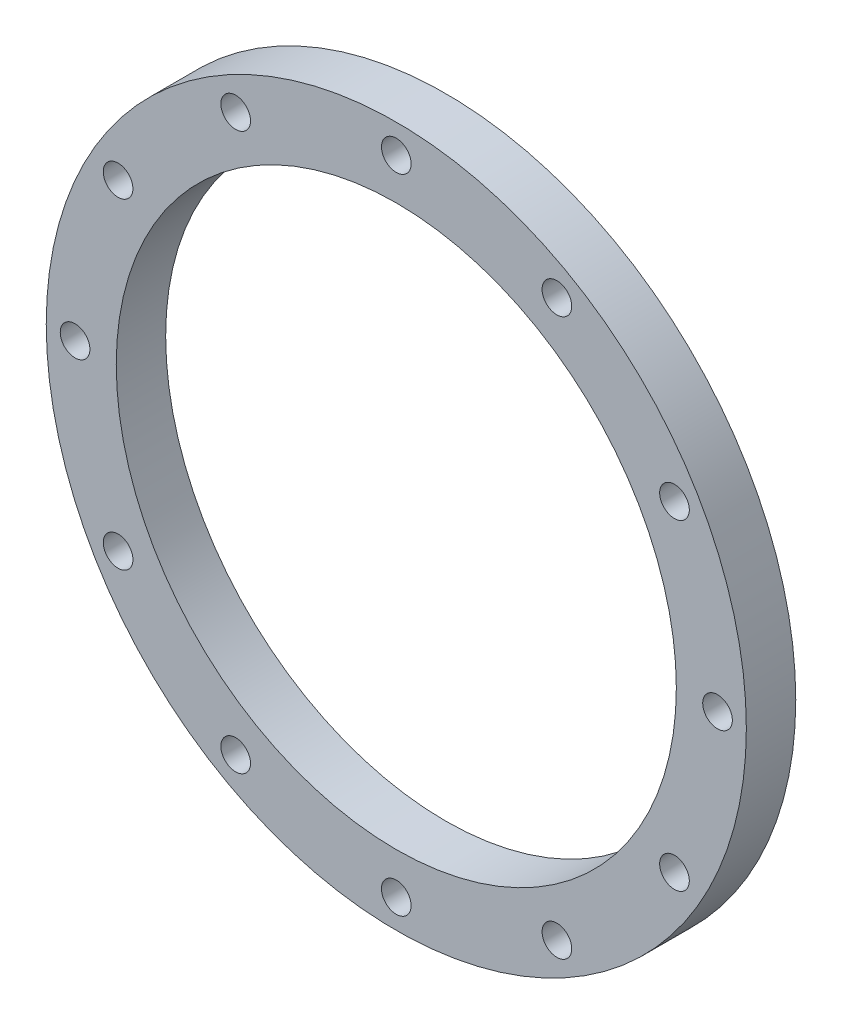
ISO-10303-21;
HEADER;
FILE_DESCRIPTION(('STEP AP214'),'2;1');
FILE_NAME('part.step','',(''),(''),'','','');
FILE_SCHEMA(('AUTOMOTIVE_DESIGN { 1 0 10303 214 1 1 1 1 }'));
ENDSEC;
DATA;
#1=APPLICATION_CONTEXT('core data for automotive mechanical design processes');
#2=APPLICATION_PROTOCOL_DEFINITION('international standard','automotive_design',2000,#1);
#3=PRODUCT_CONTEXT('',#1,'mechanical');
#4=PRODUCT('Part','Part','',(#3));
#5=PRODUCT_RELATED_PRODUCT_CATEGORY('part','',(#4));
#6=PRODUCT_DEFINITION_FORMATION('','',#4);
#7=PRODUCT_DEFINITION_CONTEXT('part definition',#1,'design');
#8=PRODUCT_DEFINITION('design','',#6,#7);
#9=PRODUCT_DEFINITION_SHAPE('','',#8);
#10=(LENGTH_UNIT() NAMED_UNIT(*) SI_UNIT(.MILLI.,.METRE.));
#11=(NAMED_UNIT(*) PLANE_ANGLE_UNIT() SI_UNIT($,.RADIAN.));
#12=(NAMED_UNIT(*) SI_UNIT($,.STERADIAN.) SOLID_ANGLE_UNIT());
#13=UNCERTAINTY_MEASURE_WITH_UNIT(LENGTH_MEASURE(1.E-05),#10,'distance_accuracy_value','');
#14=(GEOMETRIC_REPRESENTATION_CONTEXT(3) GLOBAL_UNCERTAINTY_ASSIGNED_CONTEXT((#13)) GLOBAL_UNIT_ASSIGNED_CONTEXT((#10,
#11,#12)) REPRESENTATION_CONTEXT('',''));
#15=CARTESIAN_POINT('',(0.,0.,0.));
#16=DIRECTION('',(0.,0.,1.));
#17=DIRECTION('',(1.,0.,0.));
#18=AXIS2_PLACEMENT_3D('',#15,#16,#17);
#19=CARTESIAN_POINT('',(0.,0.,6.));
#20=DIRECTION('',(0.,0.,1.));
#21=DIRECTION('',(1.,0.,0.));
#22=AXIS2_PLACEMENT_3D('',#19,#20,#21);
#23=PLANE('',#22);
#24=CARTESIAN_POINT('',(0.,0.,6.));
#25=DIRECTION('',(0.,0.,1.));
#26=DIRECTION('',(1.,0.,0.));
#27=AXIS2_PLACEMENT_3D('',#24,#25,#26);
#28=CIRCLE('',#27,34.);
#29=CARTESIAN_POINT('',(34.,0.,6.));
#30=VERTEX_POINT('',#29);
#31=EDGE_CURVE('E44',#30,#30,#28,.T.);
#32=ORIENTED_EDGE('',*,*,#31,.F.);
#33=EDGE_LOOP('',(#32));
#34=FACE_BOUND('',#33,.T.);
#35=CARTESIAN_POINT('',(0.,0.,6.));
#36=DIRECTION('',(0.,0.,1.));
#37=DIRECTION('',(1.,0.,0.));
#38=AXIS2_PLACEMENT_3D('',#35,#36,#37);
#39=CIRCLE('',#38,42.5);
#40=CARTESIAN_POINT('',(42.5,0.,6.));
#41=VERTEX_POINT('',#40);
#42=EDGE_CURVE('E10',#41,#41,#39,.T.);
#43=ORIENTED_EDGE('',*,*,#42,.T.);
#44=EDGE_LOOP('',(#43));
#45=FACE_BOUND('',#44,.T.);
#46=CARTESIAN_POINT('',(0.,39.,6.));
#47=DIRECTION('',(0.,0.,-1.));
#48=DIRECTION('',(-1.,0.,0.));
#49=AXIS2_PLACEMENT_3D('',#46,#47,#48);
#50=CIRCLE('',#49,1.8);
#51=CARTESIAN_POINT('',(-1.8,39.,6.));
#52=VERTEX_POINT('',#51);
#53=EDGE_CURVE('E49',#52,#52,#50,.T.);
#54=ORIENTED_EDGE('',*,*,#53,.T.);
#55=EDGE_LOOP('',(#54));
#56=FACE_BOUND('',#55,.T.);
#57=CARTESIAN_POINT('',(19.5,33.7749907475931,6.));
#58=DIRECTION('',(0.,0.,-1.));
#59=DIRECTION('',(-1.,0.,0.));
#60=AXIS2_PLACEMENT_3D('',#57,#58,#59);
#61=CIRCLE('',#60,1.8);
#62=CARTESIAN_POINT('',(17.7,33.7749907475931,6.));
#63=VERTEX_POINT('',#62);
#64=EDGE_CURVE('E63',#63,#63,#61,.T.);
#65=ORIENTED_EDGE('',*,*,#64,.T.);
#66=EDGE_LOOP('',(#65));
#67=FACE_BOUND('',#66,.T.);
#68=CARTESIAN_POINT('',(33.7749907475932,19.4999999999999,6.));
#69=DIRECTION('',(0.,0.,-1.));
#70=DIRECTION('',(-1.,0.,0.));
#71=AXIS2_PLACEMENT_3D('',#68,#69,#70);
#72=CIRCLE('',#71,1.8);
#73=CARTESIAN_POINT('',(31.9749907475932,19.4999999999999,6.));
#74=VERTEX_POINT('',#73);
#75=EDGE_CURVE('E75',#74,#74,#72,.T.);
#76=ORIENTED_EDGE('',*,*,#75,.T.);
#77=EDGE_LOOP('',(#76));
#78=FACE_BOUND('',#77,.T.);
#79=CARTESIAN_POINT('',(39.,-1.36167772214882E-13,6.));
#80=DIRECTION('',(0.,0.,-1.));
#81=DIRECTION('',(-1.,0.,0.));
#82=AXIS2_PLACEMENT_3D('',#79,#80,#81);
#83=CIRCLE('',#82,1.8);
#84=CARTESIAN_POINT('',(37.2,-1.36167772214882E-13,6.));
#85=VERTEX_POINT('',#84);
#86=EDGE_CURVE('E87',#85,#85,#83,.T.);
#87=ORIENTED_EDGE('',*,*,#86,.T.);
#88=EDGE_LOOP('',(#87));
#89=FACE_BOUND('',#88,.T.);
#90=CARTESIAN_POINT('',(33.774990747593,-19.5000000000002,6.));
#91=DIRECTION('',(0.,0.,-1.));
#92=DIRECTION('',(-1.,0.,0.));
#93=AXIS2_PLACEMENT_3D('',#90,#91,#92);
#94=CIRCLE('',#93,1.8);
#95=CARTESIAN_POINT('',(31.974990747593,-19.5000000000002,6.));
#96=VERTEX_POINT('',#95);
#97=EDGE_CURVE('E99',#96,#96,#94,.T.);
#98=ORIENTED_EDGE('',*,*,#97,.T.);
#99=EDGE_LOOP('',(#98));
#100=FACE_BOUND('',#99,.T.);
#101=CARTESIAN_POINT('',(19.4999999999998,-33.7749907475932,6.));
#102=DIRECTION('',(0.,0.,-1.));
#103=DIRECTION('',(-1.,0.,0.));
#104=AXIS2_PLACEMENT_3D('',#101,#102,#103);
#105=CIRCLE('',#104,1.8);
#106=CARTESIAN_POINT('',(17.6999999999998,-33.7749907475932,6.));
#107=VERTEX_POINT('',#106);
#108=EDGE_CURVE('E111',#107,#107,#105,.T.);
#109=ORIENTED_EDGE('',*,*,#108,.T.);
#110=EDGE_LOOP('',(#109));
#111=FACE_BOUND('',#110,.T.);
#112=CARTESIAN_POINT('',(0.,-39.,6.));
#113=DIRECTION('',(0.,0.,-1.));
#114=DIRECTION('',(-1.,0.,0.));
#115=AXIS2_PLACEMENT_3D('',#112,#113,#114);
#116=CIRCLE('',#115,1.8);
#117=CARTESIAN_POINT('',(-1.8,-39.,6.));
#118=VERTEX_POINT('',#117);
#119=EDGE_CURVE('E123',#118,#118,#116,.T.);
#120=ORIENTED_EDGE('',*,*,#119,.T.);
#121=EDGE_LOOP('',(#120));
#122=FACE_BOUND('',#121,.T.);
#123=CARTESIAN_POINT('',(-19.5000000000003,-33.774990747593,6.));
#124=DIRECTION('',(0.,0.,-1.));
#125=DIRECTION('',(-1.,0.,0.));
#126=AXIS2_PLACEMENT_3D('',#123,#124,#125);
#127=CIRCLE('',#126,1.8);
#128=CARTESIAN_POINT('',(-21.3000000000003,-33.774990747593,6.));
#129=VERTEX_POINT('',#128);
#130=EDGE_CURVE('E135',#129,#129,#127,.T.);
#131=ORIENTED_EDGE('',*,*,#130,.T.);
#132=EDGE_LOOP('',(#131));
#133=FACE_BOUND('',#132,.T.);
#134=CARTESIAN_POINT('',(-33.7749907475933,-19.4999999999997,6.));
#135=DIRECTION('',(0.,0.,-1.));
#136=DIRECTION('',(-1.,0.,0.));
#137=AXIS2_PLACEMENT_3D('',#134,#135,#136);
#138=CIRCLE('',#137,1.8);
#139=CARTESIAN_POINT('',(-35.5749907475933,-19.4999999999997,6.));
#140=VERTEX_POINT('',#139);
#141=EDGE_CURVE('E147',#140,#140,#138,.T.);
#142=ORIENTED_EDGE('',*,*,#141,.T.);
#143=EDGE_LOOP('',(#142));
#144=FACE_BOUND('',#143,.T.);
#145=CARTESIAN_POINT('',(-39.,4.08503316644647E-13,6.));
#146=DIRECTION('',(0.,0.,-1.));
#147=DIRECTION('',(-1.,0.,0.));
#148=AXIS2_PLACEMENT_3D('',#145,#146,#147);
#149=CIRCLE('',#148,1.8);
#150=CARTESIAN_POINT('',(-40.8,4.08503316644647E-13,6.));
#151=VERTEX_POINT('',#150);
#152=EDGE_CURVE('E159',#151,#151,#149,.T.);
#153=ORIENTED_EDGE('',*,*,#152,.T.);
#154=EDGE_LOOP('',(#153));
#155=FACE_BOUND('',#154,.T.);
#156=CARTESIAN_POINT('',(-33.7749907475929,19.5000000000004,6.));
#157=DIRECTION('',(0.,0.,-1.));
#158=DIRECTION('',(-1.,0.,0.));
#159=AXIS2_PLACEMENT_3D('',#156,#157,#158);
#160=CIRCLE('',#159,1.8);
#161=CARTESIAN_POINT('',(-35.5749907475929,19.5000000000004,6.));
#162=VERTEX_POINT('',#161);
#163=EDGE_CURVE('E171',#162,#162,#160,.T.);
#164=ORIENTED_EDGE('',*,*,#163,.T.);
#165=EDGE_LOOP('',(#164));
#166=FACE_BOUND('',#165,.T.);
#167=CARTESIAN_POINT('',(-19.4999999999996,33.7749907475933,6.));
#168=DIRECTION('',(0.,0.,-1.));
#169=DIRECTION('',(-1.,0.,0.));
#170=AXIS2_PLACEMENT_3D('',#167,#168,#169);
#171=CIRCLE('',#170,1.8);
#172=CARTESIAN_POINT('',(-21.2999999999996,33.7749907475933,6.));
#173=VERTEX_POINT('',#172);
#174=EDGE_CURVE('E183',#173,#173,#171,.T.);
#175=ORIENTED_EDGE('',*,*,#174,.T.);
#176=EDGE_LOOP('',(#175));
#177=FACE_BOUND('',#176,.T.);
#178=ADVANCED_FACE('F33',(#34,#45,#56,#67,#78,#89,#100,#111,#122,#133,#144,#155,#166,#177),#23,.T.);
#179=CARTESIAN_POINT('',(0.,0.,0.));
#180=DIRECTION('',(0.,0.,1.));
#181=DIRECTION('',(1.,0.,0.));
#182=AXIS2_PLACEMENT_3D('',#179,#180,#181);
#183=PLANE('',#182);
#184=CARTESIAN_POINT('',(-19.4999999999996,33.7749907475933,0.));
#185=DIRECTION('',(0.,0.,-1.));
#186=DIRECTION('',(-1.,0.,0.));
#187=AXIS2_PLACEMENT_3D('',#184,#185,#186);
#188=CIRCLE('',#187,3.);
#189=CARTESIAN_POINT('',(-22.4999999999996,33.7749907475933,0.));
#190=VERTEX_POINT('',#189);
#191=EDGE_CURVE('E192',#190,#190,#188,.T.);
#192=ORIENTED_EDGE('',*,*,#191,.F.);
#193=EDGE_LOOP('',(#192));
#194=FACE_BOUND('',#193,.T.);
#195=CARTESIAN_POINT('',(-33.7749907475929,19.5000000000004,0.));
#196=DIRECTION('',(0.,0.,-1.));
#197=DIRECTION('',(-1.,0.,0.));
#198=AXIS2_PLACEMENT_3D('',#195,#196,#197);
#199=CIRCLE('',#198,3.);
#200=CARTESIAN_POINT('',(-36.7749907475929,19.5000000000004,0.));
#201=VERTEX_POINT('',#200);
#202=EDGE_CURVE('E180',#201,#201,#199,.T.);
#203=ORIENTED_EDGE('',*,*,#202,.F.);
#204=EDGE_LOOP('',(#203));
#205=FACE_BOUND('',#204,.T.);
#206=CARTESIAN_POINT('',(-39.,4.08503316644647E-13,0.));
#207=DIRECTION('',(0.,0.,-1.));
#208=DIRECTION('',(-1.,0.,0.));
#209=AXIS2_PLACEMENT_3D('',#206,#207,#208);
#210=CIRCLE('',#209,3.);
#211=CARTESIAN_POINT('',(-42.,4.08503316644647E-13,0.));
#212=VERTEX_POINT('',#211);
#213=EDGE_CURVE('E168',#212,#212,#210,.T.);
#214=ORIENTED_EDGE('',*,*,#213,.F.);
#215=EDGE_LOOP('',(#214));
#216=FACE_BOUND('',#215,.T.);
#217=CARTESIAN_POINT('',(-33.7749907475933,-19.4999999999997,0.));
#218=DIRECTION('',(0.,0.,-1.));
#219=DIRECTION('',(-1.,0.,0.));
#220=AXIS2_PLACEMENT_3D('',#217,#218,#219);
#221=CIRCLE('',#220,3.);
#222=CARTESIAN_POINT('',(-36.7749907475933,-19.4999999999997,0.));
#223=VERTEX_POINT('',#222);
#224=EDGE_CURVE('E156',#223,#223,#221,.T.);
#225=ORIENTED_EDGE('',*,*,#224,.F.);
#226=EDGE_LOOP('',(#225));
#227=FACE_BOUND('',#226,.T.);
#228=CARTESIAN_POINT('',(0.,-39.,0.));
#229=DIRECTION('',(0.,0.,-1.));
#230=DIRECTION('',(-1.,0.,0.));
#231=AXIS2_PLACEMENT_3D('',#228,#229,#230);
#232=CIRCLE('',#231,3.);
#233=CARTESIAN_POINT('',(-3.,-39.,0.));
#234=VERTEX_POINT('',#233);
#235=EDGE_CURVE('E132',#234,#234,#232,.T.);
#236=ORIENTED_EDGE('',*,*,#235,.F.);
#237=EDGE_LOOP('',(#236));
#238=FACE_BOUND('',#237,.T.);
#239=CARTESIAN_POINT('',(19.4999999999998,-33.7749907475932,0.));
#240=DIRECTION('',(0.,0.,-1.));
#241=DIRECTION('',(-1.,0.,0.));
#242=AXIS2_PLACEMENT_3D('',#239,#240,#241);
#243=CIRCLE('',#242,3.);
#244=CARTESIAN_POINT('',(16.4999999999998,-33.7749907475932,0.));
#245=VERTEX_POINT('',#244);
#246=EDGE_CURVE('E120',#245,#245,#243,.T.);
#247=ORIENTED_EDGE('',*,*,#246,.F.);
#248=EDGE_LOOP('',(#247));
#249=FACE_BOUND('',#248,.T.);
#250=CARTESIAN_POINT('',(33.774990747593,-19.5000000000002,0.));
#251=DIRECTION('',(0.,0.,-1.));
#252=DIRECTION('',(-1.,0.,0.));
#253=AXIS2_PLACEMENT_3D('',#250,#251,#252);
#254=CIRCLE('',#253,3.);
#255=CARTESIAN_POINT('',(30.774990747593,-19.5000000000002,0.));
#256=VERTEX_POINT('',#255);
#257=EDGE_CURVE('E108',#256,#256,#254,.T.);
#258=ORIENTED_EDGE('',*,*,#257,.F.);
#259=EDGE_LOOP('',(#258));
#260=FACE_BOUND('',#259,.T.);
#261=CARTESIAN_POINT('',(39.,-1.36167772214882E-13,0.));
#262=DIRECTION('',(0.,0.,-1.));
#263=DIRECTION('',(-1.,0.,0.));
#264=AXIS2_PLACEMENT_3D('',#261,#262,#263);
#265=CIRCLE('',#264,3.);
#266=CARTESIAN_POINT('',(36.,-1.36167772214882E-13,0.));
#267=VERTEX_POINT('',#266);
#268=EDGE_CURVE('E96',#267,#267,#265,.T.);
#269=ORIENTED_EDGE('',*,*,#268,.F.);
#270=EDGE_LOOP('',(#269));
#271=FACE_BOUND('',#270,.T.);
#272=CARTESIAN_POINT('',(33.7749907475932,19.4999999999999,0.));
#273=DIRECTION('',(0.,0.,-1.));
#274=DIRECTION('',(-1.,0.,0.));
#275=AXIS2_PLACEMENT_3D('',#272,#273,#274);
#276=CIRCLE('',#275,3.);
#277=CARTESIAN_POINT('',(30.7749907475932,19.4999999999999,0.));
#278=VERTEX_POINT('',#277);
#279=EDGE_CURVE('E84',#278,#278,#276,.T.);
#280=ORIENTED_EDGE('',*,*,#279,.F.);
#281=EDGE_LOOP('',(#280));
#282=FACE_BOUND('',#281,.T.);
#283=CARTESIAN_POINT('',(19.5,33.7749907475931,0.));
#284=DIRECTION('',(0.,0.,-1.));
#285=DIRECTION('',(-1.,0.,0.));
#286=AXIS2_PLACEMENT_3D('',#283,#284,#285);
#287=CIRCLE('',#286,3.);
#288=CARTESIAN_POINT('',(16.5,33.7749907475931,0.));
#289=VERTEX_POINT('',#288);
#290=EDGE_CURVE('E72',#289,#289,#287,.T.);
#291=ORIENTED_EDGE('',*,*,#290,.F.);
#292=EDGE_LOOP('',(#291));
#293=FACE_BOUND('',#292,.T.);
#294=CARTESIAN_POINT('',(0.,39.,0.));
#295=DIRECTION('',(0.,0.,-1.));
#296=DIRECTION('',(-1.,0.,0.));
#297=AXIS2_PLACEMENT_3D('',#294,#295,#296);
#298=CIRCLE('',#297,3.);
#299=CARTESIAN_POINT('',(-3.,39.,0.));
#300=VERTEX_POINT('',#299);
#301=EDGE_CURVE('E60',#300,#300,#298,.T.);
#302=ORIENTED_EDGE('',*,*,#301,.F.);
#303=EDGE_LOOP('',(#302));
#304=FACE_BOUND('',#303,.T.);
#305=CARTESIAN_POINT('',(0.,0.,0.));
#306=DIRECTION('',(0.,0.,1.));
#307=DIRECTION('',(1.,0.,0.));
#308=AXIS2_PLACEMENT_3D('',#305,#306,#307);
#309=CIRCLE('',#308,42.5);
#310=CARTESIAN_POINT('',(42.5,0.,0.));
#311=VERTEX_POINT('',#310);
#312=EDGE_CURVE('E37',#311,#311,#309,.T.);
#313=ORIENTED_EDGE('',*,*,#312,.F.);
#314=EDGE_LOOP('',(#313));
#315=FACE_BOUND('',#314,.T.);
#316=CARTESIAN_POINT('',(0.,0.,0.));
#317=DIRECTION('',(0.,0.,1.));
#318=DIRECTION('',(1.,0.,0.));
#319=AXIS2_PLACEMENT_3D('',#316,#317,#318);
#320=CIRCLE('',#319,34.);
#321=CARTESIAN_POINT('',(34.,0.,0.));
#322=VERTEX_POINT('',#321);
#323=EDGE_CURVE('E46',#322,#322,#320,.T.);
#324=ORIENTED_EDGE('',*,*,#323,.T.);
#325=EDGE_LOOP('',(#324));
#326=FACE_BOUND('',#325,.T.);
#327=CARTESIAN_POINT('',(-19.5000000000003,-33.774990747593,0.));
#328=DIRECTION('',(0.,0.,-1.));
#329=DIRECTION('',(-1.,0.,0.));
#330=AXIS2_PLACEMENT_3D('',#327,#328,#329);
#331=CIRCLE('',#330,3.);
#332=CARTESIAN_POINT('',(-22.5000000000003,-33.774990747593,0.));
#333=VERTEX_POINT('',#332);
#334=EDGE_CURVE('E144',#333,#333,#331,.T.);
#335=ORIENTED_EDGE('',*,*,#334,.F.);
#336=EDGE_LOOP('',(#335));
#337=FACE_BOUND('',#336,.T.);
#338=ADVANCED_FACE('F198',(#194,#205,#216,#227,#238,#249,#260,#271,#282,#293,#304,#315,#326,
#337),#183,.F.);
#339=CARTESIAN_POINT('',(0.,0.,6.));
#340=DIRECTION('',(0.,0.,-1.));
#341=DIRECTION('',(-1.,0.,0.));
#342=AXIS2_PLACEMENT_3D('',#339,#340,#341);
#343=CYLINDRICAL_SURFACE('',#342,42.5);
#344=ORIENTED_EDGE('',*,*,#42,.F.);
#345=EDGE_LOOP('',(#344));
#346=FACE_BOUND('',#345,.T.);
#347=ORIENTED_EDGE('',*,*,#312,.T.);
#348=EDGE_LOOP('',(#347));
#349=FACE_BOUND('',#348,.T.);
#350=ADVANCED_FACE('F35',(#346,#349),#343,.T.);
#351=CARTESIAN_POINT('',(0.,0.,6.));
#352=DIRECTION('',(0.,0.,-1.));
#353=DIRECTION('',(-1.,0.,0.));
#354=AXIS2_PLACEMENT_3D('',#351,#352,#353);
#355=CYLINDRICAL_SURFACE('',#354,34.);
#356=ORIENTED_EDGE('',*,*,#31,.T.);
#357=EDGE_LOOP('',(#356));
#358=FACE_BOUND('',#357,.T.);
#359=ORIENTED_EDGE('',*,*,#323,.F.);
#360=EDGE_LOOP('',(#359));
#361=FACE_BOUND('',#360,.T.);
#362=ADVANCED_FACE('F251',(#358,#361),#355,.F.);
#363=CARTESIAN_POINT('',(0.,39.,0.));
#364=DIRECTION('',(0.,0.,-1.));
#365=DIRECTION('',(-1.,0.,0.));
#366=AXIS2_PLACEMENT_3D('',#363,#364,#365);
#367=CYLINDRICAL_SURFACE('',#366,1.8);
#368=ORIENTED_EDGE('',*,*,#53,.F.);
#369=EDGE_LOOP('',(#368));
#370=FACE_BOUND('',#369,.T.);
#371=CARTESIAN_POINT('',(0.,39.,3.4));
#372=DIRECTION('',(0.,0.,-1.));
#373=DIRECTION('',(-1.,0.,0.));
#374=AXIS2_PLACEMENT_3D('',#371,#372,#373);
#375=CIRCLE('',#374,1.8);
#376=CARTESIAN_POINT('',(-1.8,39.,3.4));
#377=VERTEX_POINT('',#376);
#378=EDGE_CURVE('E54',#377,#377,#375,.T.);
#379=ORIENTED_EDGE('',*,*,#378,.T.);
#380=EDGE_LOOP('',(#379));
#381=FACE_BOUND('',#380,.T.);
#382=ADVANCED_FACE('F254',(#370,#381),#367,.F.);
#383=CARTESIAN_POINT('',(1.8,39.,3.4));
#384=DIRECTION('',(0.,0.,1.));
#385=DIRECTION('',(1.,0.,0.));
#386=AXIS2_PLACEMENT_3D('',#383,#384,#385);
#387=PLANE('',#386);
#388=ORIENTED_EDGE('',*,*,#378,.F.);
#389=EDGE_LOOP('',(#388));
#390=FACE_BOUND('',#389,.T.);
#391=CARTESIAN_POINT('',(0.,39.,3.4));
#392=DIRECTION('',(0.,0.,-1.));
#393=DIRECTION('',(-1.,0.,0.));
#394=AXIS2_PLACEMENT_3D('',#391,#392,#393);
#395=CIRCLE('',#394,3.);
#396=CARTESIAN_POINT('',(-3.,39.,3.4));
#397=VERTEX_POINT('',#396);
#398=EDGE_CURVE('E57',#397,#397,#395,.T.);
#399=ORIENTED_EDGE('',*,*,#398,.T.);
#400=EDGE_LOOP('',(#399));
#401=FACE_BOUND('',#400,.T.);
#402=ADVANCED_FACE('F258',(#390,#401),#387,.F.);
#403=CARTESIAN_POINT('',(0.,39.,0.));
#404=DIRECTION('',(0.,0.,-1.));
#405=DIRECTION('',(-1.,0.,0.));
#406=AXIS2_PLACEMENT_3D('',#403,#404,#405);
#407=CYLINDRICAL_SURFACE('',#406,3.);
#408=ORIENTED_EDGE('',*,*,#398,.F.);
#409=EDGE_LOOP('',(#408));
#410=FACE_BOUND('',#409,.T.);
#411=ORIENTED_EDGE('',*,*,#301,.T.);
#412=EDGE_LOOP('',(#411));
#413=FACE_BOUND('',#412,.T.);
#414=ADVANCED_FACE('F262',(#410,#413),#407,.F.);
#415=CARTESIAN_POINT('',(19.5,33.7749907475931,0.));
#416=DIRECTION('',(0.,0.,-1.));
#417=DIRECTION('',(-1.,0.,0.));
#418=AXIS2_PLACEMENT_3D('',#415,#416,#417);
#419=CYLINDRICAL_SURFACE('',#418,1.8);
#420=ORIENTED_EDGE('',*,*,#64,.F.);
#421=EDGE_LOOP('',(#420));
#422=FACE_BOUND('',#421,.T.);
#423=CARTESIAN_POINT('',(19.5,33.7749907475931,3.4));
#424=DIRECTION('',(0.,0.,-1.));
#425=DIRECTION('',(-1.,0.,0.));
#426=AXIS2_PLACEMENT_3D('',#423,#424,#425);
#427=CIRCLE('',#426,1.8);
#428=CARTESIAN_POINT('',(17.7,33.7749907475931,3.4));
#429=VERTEX_POINT('',#428);
#430=EDGE_CURVE('E66',#429,#429,#427,.T.);
#431=ORIENTED_EDGE('',*,*,#430,.T.);
#432=EDGE_LOOP('',(#431));
#433=FACE_BOUND('',#432,.T.);
#434=ADVANCED_FACE('F266',(#422,#433),#419,.F.);
#435=CARTESIAN_POINT('',(21.3,33.7749907475931,3.4));
#436=DIRECTION('',(0.,0.,1.));
#437=DIRECTION('',(1.,0.,0.));
#438=AXIS2_PLACEMENT_3D('',#435,#436,#437);
#439=PLANE('',#438);
#440=ORIENTED_EDGE('',*,*,#430,.F.);
#441=EDGE_LOOP('',(#440));
#442=FACE_BOUND('',#441,.T.);
#443=CARTESIAN_POINT('',(19.5,33.7749907475931,3.4));
#444=DIRECTION('',(0.,0.,-1.));
#445=DIRECTION('',(-1.,0.,0.));
#446=AXIS2_PLACEMENT_3D('',#443,#444,#445);
#447=CIRCLE('',#446,3.);
#448=CARTESIAN_POINT('',(16.5,33.7749907475931,3.4));
#449=VERTEX_POINT('',#448);
#450=EDGE_CURVE('E69',#449,#449,#447,.T.);
#451=ORIENTED_EDGE('',*,*,#450,.T.);
#452=EDGE_LOOP('',(#451));
#453=FACE_BOUND('',#452,.T.);
#454=ADVANCED_FACE('F270',(#442,#453),#439,.F.);
#455=CARTESIAN_POINT('',(19.5,33.7749907475931,0.));
#456=DIRECTION('',(0.,0.,-1.));
#457=DIRECTION('',(-1.,0.,0.));
#458=AXIS2_PLACEMENT_3D('',#455,#456,#457);
#459=CYLINDRICAL_SURFACE('',#458,3.);
#460=ORIENTED_EDGE('',*,*,#450,.F.);
#461=EDGE_LOOP('',(#460));
#462=FACE_BOUND('',#461,.T.);
#463=ORIENTED_EDGE('',*,*,#290,.T.);
#464=EDGE_LOOP('',(#463));
#465=FACE_BOUND('',#464,.T.);
#466=ADVANCED_FACE('F274',(#462,#465),#459,.F.);
#467=CARTESIAN_POINT('',(33.7749907475932,19.4999999999999,0.));
#468=DIRECTION('',(0.,0.,-1.));
#469=DIRECTION('',(-1.,0.,0.));
#470=AXIS2_PLACEMENT_3D('',#467,#468,#469);
#471=CYLINDRICAL_SURFACE('',#470,1.8);
#472=ORIENTED_EDGE('',*,*,#75,.F.);
#473=EDGE_LOOP('',(#472));
#474=FACE_BOUND('',#473,.T.);
#475=CARTESIAN_POINT('',(33.7749907475932,19.4999999999999,3.4));
#476=DIRECTION('',(0.,0.,-1.));
#477=DIRECTION('',(-1.,0.,0.));
#478=AXIS2_PLACEMENT_3D('',#475,#476,#477);
#479=CIRCLE('',#478,1.8);
#480=CARTESIAN_POINT('',(31.9749907475932,19.4999999999999,3.4));
#481=VERTEX_POINT('',#480);
#482=EDGE_CURVE('E78',#481,#481,#479,.T.);
#483=ORIENTED_EDGE('',*,*,#482,.T.);
#484=EDGE_LOOP('',(#483));
#485=FACE_BOUND('',#484,.T.);
#486=ADVANCED_FACE('F278',(#474,#485),#471,.F.);
#487=CARTESIAN_POINT('',(35.5749907475932,19.4999999999999,3.4));
#488=DIRECTION('',(0.,0.,1.));
#489=DIRECTION('',(1.,0.,0.));
#490=AXIS2_PLACEMENT_3D('',#487,#488,#489);
#491=PLANE('',#490);
#492=ORIENTED_EDGE('',*,*,#482,.F.);
#493=EDGE_LOOP('',(#492));
#494=FACE_BOUND('',#493,.T.);
#495=CARTESIAN_POINT('',(33.7749907475932,19.4999999999999,3.4));
#496=DIRECTION('',(0.,0.,-1.));
#497=DIRECTION('',(-1.,0.,0.));
#498=AXIS2_PLACEMENT_3D('',#495,#496,#497);
#499=CIRCLE('',#498,3.);
#500=CARTESIAN_POINT('',(30.7749907475932,19.4999999999999,3.4));
#501=VERTEX_POINT('',#500);
#502=EDGE_CURVE('E81',#501,#501,#499,.T.);
#503=ORIENTED_EDGE('',*,*,#502,.T.);
#504=EDGE_LOOP('',(#503));
#505=FACE_BOUND('',#504,.T.);
#506=ADVANCED_FACE('F282',(#494,#505),#491,.F.);
#507=CARTESIAN_POINT('',(33.7749907475932,19.4999999999999,0.));
#508=DIRECTION('',(0.,0.,-1.));
#509=DIRECTION('',(-1.,0.,0.));
#510=AXIS2_PLACEMENT_3D('',#507,#508,#509);
#511=CYLINDRICAL_SURFACE('',#510,3.);
#512=ORIENTED_EDGE('',*,*,#502,.F.);
#513=EDGE_LOOP('',(#512));
#514=FACE_BOUND('',#513,.T.);
#515=ORIENTED_EDGE('',*,*,#279,.T.);
#516=EDGE_LOOP('',(#515));
#517=FACE_BOUND('',#516,.T.);
#518=ADVANCED_FACE('F286',(#514,#517),#511,.F.);
#519=CARTESIAN_POINT('',(39.,-1.36167772214882E-13,0.));
#520=DIRECTION('',(0.,0.,-1.));
#521=DIRECTION('',(-1.,0.,0.));
#522=AXIS2_PLACEMENT_3D('',#519,#520,#521);
#523=CYLINDRICAL_SURFACE('',#522,1.8);
#524=ORIENTED_EDGE('',*,*,#86,.F.);
#525=EDGE_LOOP('',(#524));
#526=FACE_BOUND('',#525,.T.);
#527=CARTESIAN_POINT('',(39.,-1.36167772214882E-13,3.4));
#528=DIRECTION('',(0.,0.,-1.));
#529=DIRECTION('',(-1.,0.,0.));
#530=AXIS2_PLACEMENT_3D('',#527,#528,#529);
#531=CIRCLE('',#530,1.8);
#532=CARTESIAN_POINT('',(37.2,-1.36167772214882E-13,3.4));
#533=VERTEX_POINT('',#532);
#534=EDGE_CURVE('E90',#533,#533,#531,.T.);
#535=ORIENTED_EDGE('',*,*,#534,.T.);
#536=EDGE_LOOP('',(#535));
#537=FACE_BOUND('',#536,.T.);
#538=ADVANCED_FACE('F290',(#526,#537),#523,.F.);
#539=CARTESIAN_POINT('',(40.8,-1.36167772214882E-13,3.4));
#540=DIRECTION('',(0.,0.,1.));
#541=DIRECTION('',(1.,0.,0.));
#542=AXIS2_PLACEMENT_3D('',#539,#540,#541);
#543=PLANE('',#542);
#544=ORIENTED_EDGE('',*,*,#534,.F.);
#545=EDGE_LOOP('',(#544));
#546=FACE_BOUND('',#545,.T.);
#547=CARTESIAN_POINT('',(39.,-1.36167772214882E-13,3.4));
#548=DIRECTION('',(0.,0.,-1.));
#549=DIRECTION('',(-1.,0.,0.));
#550=AXIS2_PLACEMENT_3D('',#547,#548,#549);
#551=CIRCLE('',#550,3.);
#552=CARTESIAN_POINT('',(36.,-1.36167772214882E-13,3.4));
#553=VERTEX_POINT('',#552);
#554=EDGE_CURVE('E93',#553,#553,#551,.T.);
#555=ORIENTED_EDGE('',*,*,#554,.T.);
#556=EDGE_LOOP('',(#555));
#557=FACE_BOUND('',#556,.T.);
#558=ADVANCED_FACE('F294',(#546,#557),#543,.F.);
#559=CARTESIAN_POINT('',(39.,-1.36167772214882E-13,0.));
#560=DIRECTION('',(0.,0.,-1.));
#561=DIRECTION('',(-1.,0.,0.));
#562=AXIS2_PLACEMENT_3D('',#559,#560,#561);
#563=CYLINDRICAL_SURFACE('',#562,3.);
#564=ORIENTED_EDGE('',*,*,#554,.F.);
#565=EDGE_LOOP('',(#564));
#566=FACE_BOUND('',#565,.T.);
#567=ORIENTED_EDGE('',*,*,#268,.T.);
#568=EDGE_LOOP('',(#567));
#569=FACE_BOUND('',#568,.T.);
#570=ADVANCED_FACE('F298',(#566,#569),#563,.F.);
#571=CARTESIAN_POINT('',(33.774990747593,-19.5000000000002,0.));
#572=DIRECTION('',(0.,0.,-1.));
#573=DIRECTION('',(-1.,0.,0.));
#574=AXIS2_PLACEMENT_3D('',#571,#572,#573);
#575=CYLINDRICAL_SURFACE('',#574,1.8);
#576=ORIENTED_EDGE('',*,*,#97,.F.);
#577=EDGE_LOOP('',(#576));
#578=FACE_BOUND('',#577,.T.);
#579=CARTESIAN_POINT('',(33.774990747593,-19.5000000000002,3.4));
#580=DIRECTION('',(0.,0.,-1.));
#581=DIRECTION('',(-1.,0.,0.));
#582=AXIS2_PLACEMENT_3D('',#579,#580,#581);
#583=CIRCLE('',#582,1.8);
#584=CARTESIAN_POINT('',(31.974990747593,-19.5000000000002,3.4));
#585=VERTEX_POINT('',#584);
#586=EDGE_CURVE('E102',#585,#585,#583,.T.);
#587=ORIENTED_EDGE('',*,*,#586,.T.);
#588=EDGE_LOOP('',(#587));
#589=FACE_BOUND('',#588,.T.);
#590=ADVANCED_FACE('F302',(#578,#589),#575,.F.);
#591=CARTESIAN_POINT('',(35.574990747593,-19.5000000000002,3.4));
#592=DIRECTION('',(0.,0.,1.));
#593=DIRECTION('',(1.,0.,0.));
#594=AXIS2_PLACEMENT_3D('',#591,#592,#593);
#595=PLANE('',#594);
#596=ORIENTED_EDGE('',*,*,#586,.F.);
#597=EDGE_LOOP('',(#596));
#598=FACE_BOUND('',#597,.T.);
#599=CARTESIAN_POINT('',(33.774990747593,-19.5000000000002,3.4));
#600=DIRECTION('',(0.,0.,-1.));
#601=DIRECTION('',(-1.,0.,0.));
#602=AXIS2_PLACEMENT_3D('',#599,#600,#601);
#603=CIRCLE('',#602,3.);
#604=CARTESIAN_POINT('',(30.774990747593,-19.5000000000002,3.4));
#605=VERTEX_POINT('',#604);
#606=EDGE_CURVE('E105',#605,#605,#603,.T.);
#607=ORIENTED_EDGE('',*,*,#606,.T.);
#608=EDGE_LOOP('',(#607));
#609=FACE_BOUND('',#608,.T.);
#610=ADVANCED_FACE('F306',(#598,#609),#595,.F.);
#611=CARTESIAN_POINT('',(33.774990747593,-19.5000000000002,0.));
#612=DIRECTION('',(0.,0.,-1.));
#613=DIRECTION('',(-1.,0.,0.));
#614=AXIS2_PLACEMENT_3D('',#611,#612,#613);
#615=CYLINDRICAL_SURFACE('',#614,3.);
#616=ORIENTED_EDGE('',*,*,#606,.F.);
#617=EDGE_LOOP('',(#616));
#618=FACE_BOUND('',#617,.T.);
#619=ORIENTED_EDGE('',*,*,#257,.T.);
#620=EDGE_LOOP('',(#619));
#621=FACE_BOUND('',#620,.T.);
#622=ADVANCED_FACE('F310',(#618,#621),#615,.F.);
#623=CARTESIAN_POINT('',(19.4999999999998,-33.7749907475932,0.));
#624=DIRECTION('',(0.,0.,-1.));
#625=DIRECTION('',(-1.,0.,0.));
#626=AXIS2_PLACEMENT_3D('',#623,#624,#625);
#627=CYLINDRICAL_SURFACE('',#626,1.8);
#628=ORIENTED_EDGE('',*,*,#108,.F.);
#629=EDGE_LOOP('',(#628));
#630=FACE_BOUND('',#629,.T.);
#631=CARTESIAN_POINT('',(19.4999999999998,-33.7749907475932,3.4));
#632=DIRECTION('',(0.,0.,-1.));
#633=DIRECTION('',(-1.,0.,0.));
#634=AXIS2_PLACEMENT_3D('',#631,#632,#633);
#635=CIRCLE('',#634,1.8);
#636=CARTESIAN_POINT('',(17.6999999999998,-33.7749907475932,3.4));
#637=VERTEX_POINT('',#636);
#638=EDGE_CURVE('E114',#637,#637,#635,.T.);
#639=ORIENTED_EDGE('',*,*,#638,.T.);
#640=EDGE_LOOP('',(#639));
#641=FACE_BOUND('',#640,.T.);
#642=ADVANCED_FACE('F314',(#630,#641),#627,.F.);
#643=CARTESIAN_POINT('',(21.2999999999998,-33.7749907475932,3.4));
#644=DIRECTION('',(0.,0.,1.));
#645=DIRECTION('',(1.,0.,0.));
#646=AXIS2_PLACEMENT_3D('',#643,#644,#645);
#647=PLANE('',#646);
#648=ORIENTED_EDGE('',*,*,#638,.F.);
#649=EDGE_LOOP('',(#648));
#650=FACE_BOUND('',#649,.T.);
#651=CARTESIAN_POINT('',(19.4999999999998,-33.7749907475932,3.4));
#652=DIRECTION('',(0.,0.,-1.));
#653=DIRECTION('',(-1.,0.,0.));
#654=AXIS2_PLACEMENT_3D('',#651,#652,#653);
#655=CIRCLE('',#654,3.);
#656=CARTESIAN_POINT('',(16.4999999999998,-33.7749907475932,3.4));
#657=VERTEX_POINT('',#656);
#658=EDGE_CURVE('E117',#657,#657,#655,.T.);
#659=ORIENTED_EDGE('',*,*,#658,.T.);
#660=EDGE_LOOP('',(#659));
#661=FACE_BOUND('',#660,.T.);
#662=ADVANCED_FACE('F318',(#650,#661),#647,.F.);
#663=CARTESIAN_POINT('',(19.4999999999998,-33.7749907475932,0.));
#664=DIRECTION('',(0.,0.,-1.));
#665=DIRECTION('',(-1.,0.,0.));
#666=AXIS2_PLACEMENT_3D('',#663,#664,#665);
#667=CYLINDRICAL_SURFACE('',#666,3.);
#668=ORIENTED_EDGE('',*,*,#658,.F.);
#669=EDGE_LOOP('',(#668));
#670=FACE_BOUND('',#669,.T.);
#671=ORIENTED_EDGE('',*,*,#246,.T.);
#672=EDGE_LOOP('',(#671));
#673=FACE_BOUND('',#672,.T.);
#674=ADVANCED_FACE('F322',(#670,#673),#667,.F.);
#675=CARTESIAN_POINT('',(0.,-39.,0.));
#676=DIRECTION('',(0.,0.,-1.));
#677=DIRECTION('',(-1.,0.,0.));
#678=AXIS2_PLACEMENT_3D('',#675,#676,#677);
#679=CYLINDRICAL_SURFACE('',#678,1.8);
#680=ORIENTED_EDGE('',*,*,#119,.F.);
#681=EDGE_LOOP('',(#680));
#682=FACE_BOUND('',#681,.T.);
#683=CARTESIAN_POINT('',(0.,-39.,3.4));
#684=DIRECTION('',(0.,0.,-1.));
#685=DIRECTION('',(-1.,0.,0.));
#686=AXIS2_PLACEMENT_3D('',#683,#684,#685);
#687=CIRCLE('',#686,1.8);
#688=CARTESIAN_POINT('',(-1.8,-39.,3.4));
#689=VERTEX_POINT('',#688);
#690=EDGE_CURVE('E126',#689,#689,#687,.T.);
#691=ORIENTED_EDGE('',*,*,#690,.T.);
#692=EDGE_LOOP('',(#691));
#693=FACE_BOUND('',#692,.T.);
#694=ADVANCED_FACE('F326',(#682,#693),#679,.F.);
#695=CARTESIAN_POINT('',(1.8,-39.,3.4));
#696=DIRECTION('',(0.,0.,1.));
#697=DIRECTION('',(1.,0.,0.));
#698=AXIS2_PLACEMENT_3D('',#695,#696,#697);
#699=PLANE('',#698);
#700=ORIENTED_EDGE('',*,*,#690,.F.);
#701=EDGE_LOOP('',(#700));
#702=FACE_BOUND('',#701,.T.);
#703=CARTESIAN_POINT('',(0.,-39.,3.4));
#704=DIRECTION('',(0.,0.,-1.));
#705=DIRECTION('',(-1.,0.,0.));
#706=AXIS2_PLACEMENT_3D('',#703,#704,#705);
#707=CIRCLE('',#706,3.);
#708=CARTESIAN_POINT('',(-3.,-39.,3.4));
#709=VERTEX_POINT('',#708);
#710=EDGE_CURVE('E129',#709,#709,#707,.T.);
#711=ORIENTED_EDGE('',*,*,#710,.T.);
#712=EDGE_LOOP('',(#711));
#713=FACE_BOUND('',#712,.T.);
#714=ADVANCED_FACE('F330',(#702,#713),#699,.F.);
#715=CARTESIAN_POINT('',(0.,-39.,0.));
#716=DIRECTION('',(0.,0.,-1.));
#717=DIRECTION('',(-1.,0.,0.));
#718=AXIS2_PLACEMENT_3D('',#715,#716,#717);
#719=CYLINDRICAL_SURFACE('',#718,3.);
#720=ORIENTED_EDGE('',*,*,#710,.F.);
#721=EDGE_LOOP('',(#720));
#722=FACE_BOUND('',#721,.T.);
#723=ORIENTED_EDGE('',*,*,#235,.T.);
#724=EDGE_LOOP('',(#723));
#725=FACE_BOUND('',#724,.T.);
#726=ADVANCED_FACE('F334',(#722,#725),#719,.F.);
#727=CARTESIAN_POINT('',(-19.5000000000003,-33.774990747593,0.));
#728=DIRECTION('',(0.,0.,-1.));
#729=DIRECTION('',(-1.,0.,0.));
#730=AXIS2_PLACEMENT_3D('',#727,#728,#729);
#731=CYLINDRICAL_SURFACE('',#730,1.8);
#732=ORIENTED_EDGE('',*,*,#130,.F.);
#733=EDGE_LOOP('',(#732));
#734=FACE_BOUND('',#733,.T.);
#735=CARTESIAN_POINT('',(-19.5000000000003,-33.774990747593,3.4));
#736=DIRECTION('',(0.,0.,-1.));
#737=DIRECTION('',(-1.,0.,0.));
#738=AXIS2_PLACEMENT_3D('',#735,#736,#737);
#739=CIRCLE('',#738,1.8);
#740=CARTESIAN_POINT('',(-21.3000000000003,-33.774990747593,3.4));
#741=VERTEX_POINT('',#740);
#742=EDGE_CURVE('E138',#741,#741,#739,.T.);
#743=ORIENTED_EDGE('',*,*,#742,.T.);
#744=EDGE_LOOP('',(#743));
#745=FACE_BOUND('',#744,.T.);
#746=ADVANCED_FACE('F240',(#734,#745),#731,.F.);
#747=CARTESIAN_POINT('',(-17.7000000000003,-33.774990747593,3.4));
#748=DIRECTION('',(0.,0.,1.));
#749=DIRECTION('',(1.,0.,0.));
#750=AXIS2_PLACEMENT_3D('',#747,#748,#749);
#751=PLANE('',#750);
#752=ORIENTED_EDGE('',*,*,#742,.F.);
#753=EDGE_LOOP('',(#752));
#754=FACE_BOUND('',#753,.T.);
#755=CARTESIAN_POINT('',(-19.5000000000003,-33.774990747593,3.4));
#756=DIRECTION('',(0.,0.,-1.));
#757=DIRECTION('',(-1.,0.,0.));
#758=AXIS2_PLACEMENT_3D('',#755,#756,#757);
#759=CIRCLE('',#758,3.);
#760=CARTESIAN_POINT('',(-22.5000000000003,-33.774990747593,3.4));
#761=VERTEX_POINT('',#760);
#762=EDGE_CURVE('E141',#761,#761,#759,.T.);
#763=ORIENTED_EDGE('',*,*,#762,.T.);
#764=EDGE_LOOP('',(#763));
#765=FACE_BOUND('',#764,.T.);
#766=ADVANCED_FACE('F230',(#754,#765),#751,.F.);
#767=CARTESIAN_POINT('',(-19.5000000000003,-33.774990747593,0.));
#768=DIRECTION('',(0.,0.,-1.));
#769=DIRECTION('',(-1.,0.,0.));
#770=AXIS2_PLACEMENT_3D('',#767,#768,#769);
#771=CYLINDRICAL_SURFACE('',#770,3.);
#772=ORIENTED_EDGE('',*,*,#762,.F.);
#773=EDGE_LOOP('',(#772));
#774=FACE_BOUND('',#773,.T.);
#775=ORIENTED_EDGE('',*,*,#334,.T.);
#776=EDGE_LOOP('',(#775));
#777=FACE_BOUND('',#776,.T.);
#778=ADVANCED_FACE('F227',(#774,#777),#771,.F.);
#779=CARTESIAN_POINT('',(-33.7749907475933,-19.4999999999997,0.));
#780=DIRECTION('',(0.,0.,-1.));
#781=DIRECTION('',(-1.,0.,0.));
#782=AXIS2_PLACEMENT_3D('',#779,#780,#781);
#783=CYLINDRICAL_SURFACE('',#782,1.8);
#784=ORIENTED_EDGE('',*,*,#141,.F.);
#785=EDGE_LOOP('',(#784));
#786=FACE_BOUND('',#785,.T.);
#787=CARTESIAN_POINT('',(-33.7749907475933,-19.4999999999997,3.4));
#788=DIRECTION('',(0.,0.,-1.));
#789=DIRECTION('',(-1.,0.,0.));
#790=AXIS2_PLACEMENT_3D('',#787,#788,#789);
#791=CIRCLE('',#790,1.8);
#792=CARTESIAN_POINT('',(-35.5749907475933,-19.4999999999997,3.4));
#793=VERTEX_POINT('',#792);
#794=EDGE_CURVE('E150',#793,#793,#791,.T.);
#795=ORIENTED_EDGE('',*,*,#794,.T.);
#796=EDGE_LOOP('',(#795));
#797=FACE_BOUND('',#796,.T.);
#798=ADVANCED_FACE('F229',(#786,#797),#783,.F.);
#799=CARTESIAN_POINT('',(-31.9749907475933,-19.4999999999997,3.4));
#800=DIRECTION('',(0.,0.,1.));
#801=DIRECTION('',(1.,0.,0.));
#802=AXIS2_PLACEMENT_3D('',#799,#800,#801);
#803=PLANE('',#802);
#804=ORIENTED_EDGE('',*,*,#794,.F.);
#805=EDGE_LOOP('',(#804));
#806=FACE_BOUND('',#805,.T.);
#807=CARTESIAN_POINT('',(-33.7749907475933,-19.4999999999997,3.4));
#808=DIRECTION('',(0.,0.,-1.));
#809=DIRECTION('',(-1.,0.,0.));
#810=AXIS2_PLACEMENT_3D('',#807,#808,#809);
#811=CIRCLE('',#810,3.);
#812=CARTESIAN_POINT('',(-36.7749907475933,-19.4999999999997,3.4));
#813=VERTEX_POINT('',#812);
#814=EDGE_CURVE('E153',#813,#813,#811,.T.);
#815=ORIENTED_EDGE('',*,*,#814,.T.);
#816=EDGE_LOOP('',(#815));
#817=FACE_BOUND('',#816,.T.);
#818=ADVANCED_FACE('F237',(#806,#817),#803,.F.);
#819=CARTESIAN_POINT('',(-33.7749907475933,-19.4999999999997,0.));
#820=DIRECTION('',(0.,0.,-1.));
#821=DIRECTION('',(-1.,0.,0.));
#822=AXIS2_PLACEMENT_3D('',#819,#820,#821);
#823=CYLINDRICAL_SURFACE('',#822,3.);
#824=ORIENTED_EDGE('',*,*,#814,.F.);
#825=EDGE_LOOP('',(#824));
#826=FACE_BOUND('',#825,.T.);
#827=ORIENTED_EDGE('',*,*,#224,.T.);
#828=EDGE_LOOP('',(#827));
#829=FACE_BOUND('',#828,.T.);
#830=ADVANCED_FACE('F397',(#826,#829),#823,.F.);
#831=CARTESIAN_POINT('',(-39.,4.08503316644647E-13,0.));
#832=DIRECTION('',(0.,0.,-1.));
#833=DIRECTION('',(-1.,0.,0.));
#834=AXIS2_PLACEMENT_3D('',#831,#832,#833);
#835=CYLINDRICAL_SURFACE('',#834,1.8);
#836=ORIENTED_EDGE('',*,*,#152,.F.);
#837=EDGE_LOOP('',(#836));
#838=FACE_BOUND('',#837,.T.);
#839=CARTESIAN_POINT('',(-39.,4.08503316644647E-13,3.4));
#840=DIRECTION('',(0.,0.,-1.));
#841=DIRECTION('',(-1.,0.,0.));
#842=AXIS2_PLACEMENT_3D('',#839,#840,#841);
#843=CIRCLE('',#842,1.8);
#844=CARTESIAN_POINT('',(-40.8,4.08503316644647E-13,3.4));
#845=VERTEX_POINT('',#844);
#846=EDGE_CURVE('E162',#845,#845,#843,.T.);
#847=ORIENTED_EDGE('',*,*,#846,.T.);
#848=EDGE_LOOP('',(#847));
#849=FACE_BOUND('',#848,.T.);
#850=ADVANCED_FACE('F393',(#838,#849),#835,.F.);
#851=CARTESIAN_POINT('',(-37.2,4.08503316644647E-13,3.4));
#852=DIRECTION('',(0.,0.,1.));
#853=DIRECTION('',(1.,0.,0.));
#854=AXIS2_PLACEMENT_3D('',#851,#852,#853);
#855=PLANE('',#854);
#856=ORIENTED_EDGE('',*,*,#846,.F.);
#857=EDGE_LOOP('',(#856));
#858=FACE_BOUND('',#857,.T.);
#859=CARTESIAN_POINT('',(-39.,4.08503316644647E-13,3.4));
#860=DIRECTION('',(0.,0.,-1.));
#861=DIRECTION('',(-1.,0.,0.));
#862=AXIS2_PLACEMENT_3D('',#859,#860,#861);
#863=CIRCLE('',#862,3.);
#864=CARTESIAN_POINT('',(-42.,4.08503316644647E-13,3.4));
#865=VERTEX_POINT('',#864);
#866=EDGE_CURVE('E165',#865,#865,#863,.T.);
#867=ORIENTED_EDGE('',*,*,#866,.T.);
#868=EDGE_LOOP('',(#867));
#869=FACE_BOUND('',#868,.T.);
#870=ADVANCED_FACE('F389',(#858,#869),#855,.F.);
#871=CARTESIAN_POINT('',(-39.,4.08503316644647E-13,0.));
#872=DIRECTION('',(0.,0.,-1.));
#873=DIRECTION('',(-1.,0.,0.));
#874=AXIS2_PLACEMENT_3D('',#871,#872,#873);
#875=CYLINDRICAL_SURFACE('',#874,3.);
#876=ORIENTED_EDGE('',*,*,#866,.F.);
#877=EDGE_LOOP('',(#876));
#878=FACE_BOUND('',#877,.T.);
#879=ORIENTED_EDGE('',*,*,#213,.T.);
#880=EDGE_LOOP('',(#879));
#881=FACE_BOUND('',#880,.T.);
#882=ADVANCED_FACE('F385',(#878,#881),#875,.F.);
#883=CARTESIAN_POINT('',(-33.7749907475929,19.5000000000004,0.));
#884=DIRECTION('',(0.,0.,-1.));
#885=DIRECTION('',(-1.,0.,0.));
#886=AXIS2_PLACEMENT_3D('',#883,#884,#885);
#887=CYLINDRICAL_SURFACE('',#886,1.8);
#888=ORIENTED_EDGE('',*,*,#163,.F.);
#889=EDGE_LOOP('',(#888));
#890=FACE_BOUND('',#889,.T.);
#891=CARTESIAN_POINT('',(-33.7749907475929,19.5000000000004,3.4));
#892=DIRECTION('',(0.,0.,-1.));
#893=DIRECTION('',(-1.,0.,0.));
#894=AXIS2_PLACEMENT_3D('',#891,#892,#893);
#895=CIRCLE('',#894,1.8);
#896=CARTESIAN_POINT('',(-35.5749907475929,19.5000000000004,3.4));
#897=VERTEX_POINT('',#896);
#898=EDGE_CURVE('E174',#897,#897,#895,.T.);
#899=ORIENTED_EDGE('',*,*,#898,.T.);
#900=EDGE_LOOP('',(#899));
#901=FACE_BOUND('',#900,.T.);
#902=ADVANCED_FACE('F381',(#890,#901),#887,.F.);
#903=CARTESIAN_POINT('',(-31.9749907475929,19.5000000000004,3.4));
#904=DIRECTION('',(0.,0.,1.));
#905=DIRECTION('',(1.,0.,0.));
#906=AXIS2_PLACEMENT_3D('',#903,#904,#905);
#907=PLANE('',#906);
#908=ORIENTED_EDGE('',*,*,#898,.F.);
#909=EDGE_LOOP('',(#908));
#910=FACE_BOUND('',#909,.T.);
#911=CARTESIAN_POINT('',(-33.7749907475929,19.5000000000004,3.4));
#912=DIRECTION('',(0.,0.,-1.));
#913=DIRECTION('',(-1.,0.,0.));
#914=AXIS2_PLACEMENT_3D('',#911,#912,#913);
#915=CIRCLE('',#914,3.);
#916=CARTESIAN_POINT('',(-36.7749907475929,19.5000000000004,3.4));
#917=VERTEX_POINT('',#916);
#918=EDGE_CURVE('E177',#917,#917,#915,.T.);
#919=ORIENTED_EDGE('',*,*,#918,.T.);
#920=EDGE_LOOP('',(#919));
#921=FACE_BOUND('',#920,.T.);
#922=ADVANCED_FACE('F377',(#910,#921),#907,.F.);
#923=CARTESIAN_POINT('',(-33.7749907475929,19.5000000000004,0.));
#924=DIRECTION('',(0.,0.,-1.));
#925=DIRECTION('',(-1.,0.,0.));
#926=AXIS2_PLACEMENT_3D('',#923,#924,#925);
#927=CYLINDRICAL_SURFACE('',#926,3.);
#928=ORIENTED_EDGE('',*,*,#918,.F.);
#929=EDGE_LOOP('',(#928));
#930=FACE_BOUND('',#929,.T.);
#931=ORIENTED_EDGE('',*,*,#202,.T.);
#932=EDGE_LOOP('',(#931));
#933=FACE_BOUND('',#932,.T.);
#934=ADVANCED_FACE('F361',(#930,#933),#927,.F.);
#935=CARTESIAN_POINT('',(-19.4999999999996,33.7749907475933,0.));
#936=DIRECTION('',(0.,0.,-1.));
#937=DIRECTION('',(-1.,0.,0.));
#938=AXIS2_PLACEMENT_3D('',#935,#936,#937);
#939=CYLINDRICAL_SURFACE('',#938,1.8);
#940=ORIENTED_EDGE('',*,*,#174,.F.);
#941=EDGE_LOOP('',(#940));
#942=FACE_BOUND('',#941,.T.);
#943=CARTESIAN_POINT('',(-19.4999999999996,33.7749907475933,3.4));
#944=DIRECTION('',(0.,0.,-1.));
#945=DIRECTION('',(-1.,0.,0.));
#946=AXIS2_PLACEMENT_3D('',#943,#944,#945);
#947=CIRCLE('',#946,1.8);
#948=CARTESIAN_POINT('',(-21.2999999999996,33.7749907475933,3.4));
#949=VERTEX_POINT('',#948);
#950=EDGE_CURVE('E186',#949,#949,#947,.T.);
#951=ORIENTED_EDGE('',*,*,#950,.T.);
#952=EDGE_LOOP('',(#951));
#953=FACE_BOUND('',#952,.T.);
#954=ADVANCED_FACE('F357',(#942,#953),#939,.F.);
#955=CARTESIAN_POINT('',(-17.6999999999996,33.7749907475933,3.4));
#956=DIRECTION('',(0.,0.,1.));
#957=DIRECTION('',(1.,0.,0.));
#958=AXIS2_PLACEMENT_3D('',#955,#956,#957);
#959=PLANE('',#958);
#960=ORIENTED_EDGE('',*,*,#950,.F.);
#961=EDGE_LOOP('',(#960));
#962=FACE_BOUND('',#961,.T.);
#963=CARTESIAN_POINT('',(-19.4999999999996,33.7749907475933,3.4));
#964=DIRECTION('',(0.,0.,-1.));
#965=DIRECTION('',(-1.,0.,0.));
#966=AXIS2_PLACEMENT_3D('',#963,#964,#965);
#967=CIRCLE('',#966,3.);
#968=CARTESIAN_POINT('',(-22.4999999999996,33.7749907475933,3.4));
#969=VERTEX_POINT('',#968);
#970=EDGE_CURVE('E189',#969,#969,#967,.T.);
#971=ORIENTED_EDGE('',*,*,#970,.T.);
#972=EDGE_LOOP('',(#971));
#973=FACE_BOUND('',#972,.T.);
#974=ADVANCED_FACE('F360',(#962,#973),#959,.F.);
#975=CARTESIAN_POINT('',(-19.4999999999996,33.7749907475933,0.));
#976=DIRECTION('',(0.,0.,-1.));
#977=DIRECTION('',(-1.,0.,0.));
#978=AXIS2_PLACEMENT_3D('',#975,#976,#977);
#979=CYLINDRICAL_SURFACE('',#978,3.);
#980=ORIENTED_EDGE('',*,*,#970,.F.);
#981=EDGE_LOOP('',(#980));
#982=FACE_BOUND('',#981,.T.);
#983=ORIENTED_EDGE('',*,*,#191,.T.);
#984=EDGE_LOOP('',(#983));
#985=FACE_BOUND('',#984,.T.);
#986=ADVANCED_FACE('F196',(#982,#985),#979,.F.);
#987=CLOSED_SHELL('',(#178,#338,#350,#362,#382,#402,#414,#434,#454,#466,#486,#506,#518,#538,
#558,#570,#590,#610,#622,#642,#662,#674,#694,#714,#726,#746,#766,#778,#798,#818,#830,#850,#870,
#882,#902,#922,#934,#954,#974,#986));
#988=MANIFOLD_SOLID_BREP('B2',#987);
#989=ADVANCED_BREP_SHAPE_REPRESENTATION('',(#18,#988),#14);
#990=SHAPE_DEFINITION_REPRESENTATION(#9,#989);
ENDSEC;
END-ISO-10303-21;
